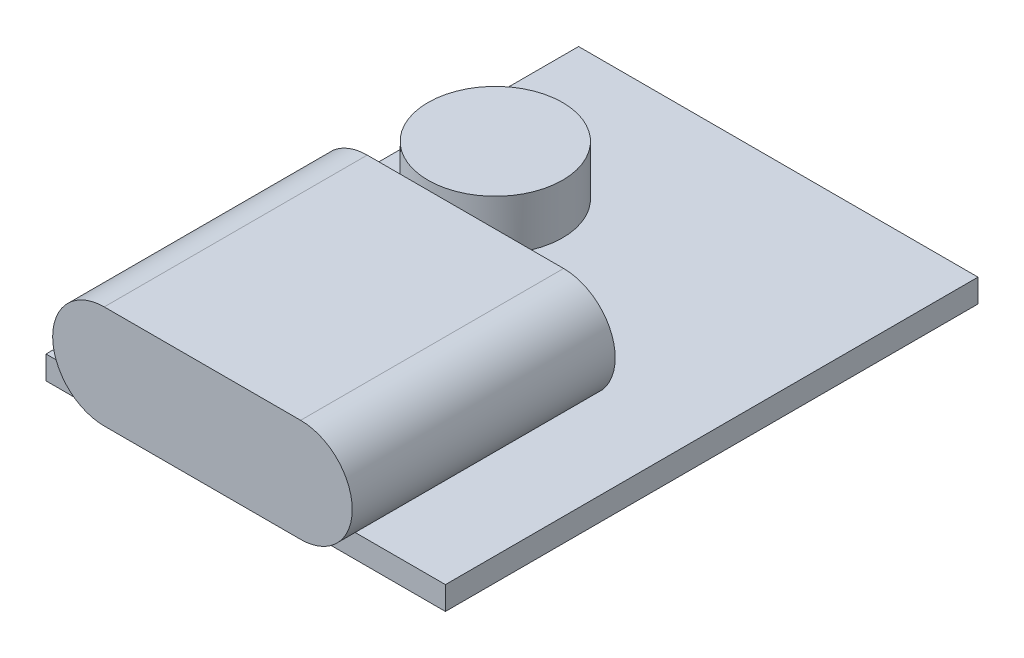
ISO-10303-21;
HEADER;
FILE_DESCRIPTION(('STEP AP214'),'2;1');
FILE_NAME('part.step','',(''),(''),'','','');
FILE_SCHEMA(('AUTOMOTIVE_DESIGN { 1 0 10303 214 1 1 1 1 }'));
ENDSEC;
DATA;
#1=APPLICATION_CONTEXT('core data for automotive mechanical design processes');
#2=APPLICATION_PROTOCOL_DEFINITION('international standard','automotive_design',2000,#1);
#3=PRODUCT_CONTEXT('',#1,'mechanical');
#4=PRODUCT('Part','Part','',(#3));
#5=PRODUCT_RELATED_PRODUCT_CATEGORY('part','',(#4));
#6=PRODUCT_DEFINITION_FORMATION('','',#4);
#7=PRODUCT_DEFINITION_CONTEXT('part definition',#1,'design');
#8=PRODUCT_DEFINITION('design','',#6,#7);
#9=PRODUCT_DEFINITION_SHAPE('','',#8);
#10=(LENGTH_UNIT() NAMED_UNIT(*) SI_UNIT(.MILLI.,.METRE.));
#11=(NAMED_UNIT(*) PLANE_ANGLE_UNIT() SI_UNIT($,.RADIAN.));
#12=(NAMED_UNIT(*) SI_UNIT($,.STERADIAN.) SOLID_ANGLE_UNIT());
#13=UNCERTAINTY_MEASURE_WITH_UNIT(LENGTH_MEASURE(1.E-05),#10,'distance_accuracy_value','');
#14=(GEOMETRIC_REPRESENTATION_CONTEXT(3) GLOBAL_UNCERTAINTY_ASSIGNED_CONTEXT((#13)) GLOBAL_UNIT_ASSIGNED_CONTEXT((#10,
#11,#12)) REPRESENTATION_CONTEXT('',''));
#15=CARTESIAN_POINT('',(0.,0.,0.));
#16=DIRECTION('',(0.,0.,1.));
#17=DIRECTION('',(1.,0.,0.));
#18=AXIS2_PLACEMENT_3D('',#15,#16,#17);
#19=CARTESIAN_POINT('',(-2.95,2.55,-6.6));
#20=DIRECTION('',(0.,0.,1.));
#21=DIRECTION('',(1.,0.,0.));
#22=AXIS2_PLACEMENT_3D('',#19,#20,#21);
#23=CYLINDRICAL_SURFACE('',#22,1.55);
#24=CARTESIAN_POINT('',(-2.95,2.55,1.3));
#25=DIRECTION('',(0.,0.,1.));
#26=DIRECTION('',(1.,0.,0.));
#27=AXIS2_PLACEMENT_3D('',#24,#25,#26);
#28=CIRCLE('',#27,1.55);
#29=CARTESIAN_POINT('',(-2.95,4.1,1.3));
#30=VERTEX_POINT('',#29);
#31=CARTESIAN_POINT('',(-2.95,1.,1.3));
#32=VERTEX_POINT('',#31);
#33=EDGE_CURVE('E109',#30,#32,#28,.T.);
#34=ORIENTED_EDGE('',*,*,#33,.F.);
#35=DIRECTION('',(0.,0.,1.));
#36=VECTOR('',#35,1.);
#37=CARTESIAN_POINT('',(-2.95,4.1,-6.6));
#38=LINE('',#37,#36);
#39=CARTESIAN_POINT('',(-2.95,4.1,-6.6));
#40=VERTEX_POINT('',#39);
#41=EDGE_CURVE('E12',#40,#30,#38,.T.);
#42=ORIENTED_EDGE('',*,*,#41,.F.);
#43=CARTESIAN_POINT('',(-2.95,2.55,-6.6));
#44=DIRECTION('',(0.,0.,1.));
#45=DIRECTION('',(1.,0.,0.));
#46=AXIS2_PLACEMENT_3D('',#43,#44,#45);
#47=CIRCLE('',#46,1.55);
#48=CARTESIAN_POINT('',(-2.95,1.,-6.6));
#49=VERTEX_POINT('',#48);
#50=EDGE_CURVE('E103',#40,#49,#47,.T.);
#51=ORIENTED_EDGE('',*,*,#50,.T.);
#52=DIRECTION('',(0.,0.,1.));
#53=VECTOR('',#52,1.);
#54=CARTESIAN_POINT('',(-2.95,1.,-6.6));
#55=LINE('',#54,#53);
#56=EDGE_CURVE('E48',#49,#32,#55,.T.);
#57=ORIENTED_EDGE('',*,*,#56,.T.);
#58=EDGE_LOOP('',(#34,#42,#51,#57));
#59=FACE_BOUND('',#58,.T.);
#60=ADVANCED_FACE('F45',(#59),#23,.T.);
#61=CARTESIAN_POINT('',(-2.95,4.1,-6.6));
#62=DIRECTION('',(0.,1.,0.));
#63=DIRECTION('',(-1.,0.,0.));
#64=AXIS2_PLACEMENT_3D('',#61,#62,#63);
#65=PLANE('',#64);
#66=DIRECTION('',(-1.,0.,0.));
#67=VECTOR('',#66,1.);
#68=CARTESIAN_POINT('',(-2.95,4.1,1.3));
#69=LINE('',#68,#67);
#70=CARTESIAN_POINT('',(2.95,4.1,1.3));
#71=VERTEX_POINT('',#70);
#72=EDGE_CURVE('E105',#71,#30,#69,.T.);
#73=ORIENTED_EDGE('',*,*,#72,.F.);
#74=DIRECTION('',(0.,0.,1.));
#75=VECTOR('',#74,1.);
#76=CARTESIAN_POINT('',(2.95,4.1,-6.6));
#77=LINE('',#76,#75);
#78=CARTESIAN_POINT('',(2.95,4.1,-6.6));
#79=VERTEX_POINT('',#78);
#80=EDGE_CURVE('E54',#79,#71,#77,.T.);
#81=ORIENTED_EDGE('',*,*,#80,.F.);
#82=DIRECTION('',(-1.,0.,0.));
#83=VECTOR('',#82,1.);
#84=CARTESIAN_POINT('',(-2.95,4.1,-6.6));
#85=LINE('',#84,#83);
#86=EDGE_CURVE('E100',#79,#40,#85,.T.);
#87=ORIENTED_EDGE('',*,*,#86,.T.);
#88=ORIENTED_EDGE('',*,*,#41,.T.);
#89=EDGE_LOOP('',(#73,#81,#87,#88));
#90=FACE_BOUND('',#89,.T.);
#91=ADVANCED_FACE('F119',(#90),#65,.T.);
#92=CARTESIAN_POINT('',(2.95,2.55,-6.6));
#93=DIRECTION('',(0.,0.,1.));
#94=DIRECTION('',(1.,0.,0.));
#95=AXIS2_PLACEMENT_3D('',#92,#93,#94);
#96=CYLINDRICAL_SURFACE('',#95,1.55);
#97=CARTESIAN_POINT('',(2.95,2.55,1.3));
#98=DIRECTION('',(0.,0.,1.));
#99=DIRECTION('',(1.,0.,0.));
#100=AXIS2_PLACEMENT_3D('',#97,#98,#99);
#101=CIRCLE('',#100,1.55);
#102=CARTESIAN_POINT('',(2.95,1.,1.3));
#103=VERTEX_POINT('',#102);
#104=EDGE_CURVE('E95',#103,#71,#101,.T.);
#105=ORIENTED_EDGE('',*,*,#104,.F.);
#106=DIRECTION('',(0.,0.,1.));
#107=VECTOR('',#106,1.);
#108=CARTESIAN_POINT('',(2.95,1.,-6.6));
#109=LINE('',#108,#107);
#110=CARTESIAN_POINT('',(2.95,1.,-6.6));
#111=VERTEX_POINT('',#110);
#112=EDGE_CURVE('E90',#111,#103,#109,.T.);
#113=ORIENTED_EDGE('',*,*,#112,.F.);
#114=CARTESIAN_POINT('',(2.95,2.55,-6.6));
#115=DIRECTION('',(0.,0.,1.));
#116=DIRECTION('',(1.,0.,0.));
#117=AXIS2_PLACEMENT_3D('',#114,#115,#116);
#118=CIRCLE('',#117,1.55);
#119=EDGE_CURVE('E93',#111,#79,#118,.T.);
#120=ORIENTED_EDGE('',*,*,#119,.T.);
#121=ORIENTED_EDGE('',*,*,#80,.T.);
#122=EDGE_LOOP('',(#105,#113,#120,#121));
#123=FACE_BOUND('',#122,.T.);
#124=ADVANCED_FACE('F92',(#123),#96,.T.);
#125=CARTESIAN_POINT('',(-2.95,1.,-6.6));
#126=DIRECTION('',(0.,-1.,0.));
#127=DIRECTION('',(1.,0.,0.));
#128=AXIS2_PLACEMENT_3D('',#125,#126,#127);
#129=PLANE('',#128);
#130=DIRECTION('',(1.,0.,0.));
#131=VECTOR('',#130,1.);
#132=CARTESIAN_POINT('',(-2.95,1.,1.3));
#133=LINE('',#132,#131);
#134=EDGE_CURVE('E112',#32,#103,#133,.T.);
#135=ORIENTED_EDGE('',*,*,#134,.F.);
#136=ORIENTED_EDGE('',*,*,#56,.F.);
#137=DIRECTION('',(1.,0.,0.));
#138=VECTOR('',#137,1.);
#139=CARTESIAN_POINT('',(-2.95,1.,-6.6));
#140=LINE('',#139,#138);
#141=EDGE_CURVE('E99',#49,#111,#140,.T.);
#142=ORIENTED_EDGE('',*,*,#141,.T.);
#143=ORIENTED_EDGE('',*,*,#112,.T.);
#144=EDGE_LOOP('',(#135,#136,#142,#143));
#145=FACE_BOUND('',#144,.T.);
#146=ADVANCED_FACE('F102',(#145),#129,.T.);
#147=CARTESIAN_POINT('',(-2.95,2.55,-6.6));
#148=DIRECTION('',(0.,0.,1.));
#149=DIRECTION('',(1.,0.,0.));
#150=AXIS2_PLACEMENT_3D('',#147,#148,#149);
#151=PLANE('',#150);
#152=ORIENTED_EDGE('',*,*,#50,.F.);
#153=ORIENTED_EDGE('',*,*,#86,.F.);
#154=ORIENTED_EDGE('',*,*,#119,.F.);
#155=ORIENTED_EDGE('',*,*,#141,.F.);
#156=EDGE_LOOP('',(#152,#153,#154,#155));
#157=FACE_BOUND('',#156,.T.);
#158=ADVANCED_FACE('F98',(#157),#151,.F.);
#159=CARTESIAN_POINT('',(-2.95,2.55,1.3));
#160=DIRECTION('',(0.,0.,1.));
#161=DIRECTION('',(1.,0.,0.));
#162=AXIS2_PLACEMENT_3D('',#159,#160,#161);
#163=PLANE('',#162);
#164=ORIENTED_EDGE('',*,*,#33,.T.);
#165=ORIENTED_EDGE('',*,*,#134,.T.);
#166=ORIENTED_EDGE('',*,*,#104,.T.);
#167=ORIENTED_EDGE('',*,*,#72,.T.);
#168=EDGE_LOOP('',(#164,#165,#166,#167));
#169=FACE_BOUND('',#168,.T.);
#170=ADVANCED_FACE('F118',(#169),#163,.T.);
#171=CLOSED_SHELL('',(#60,#91,#124,#146,#158,#170));
#172=MANIFOLD_SOLID_BREP('B2',#171);
#173=CARTESIAN_POINT('',(-6.,0.7,0.));
#174=DIRECTION('',(1.,0.,0.));
#175=DIRECTION('',(0.,0.,-1.));
#176=AXIS2_PLACEMENT_3D('',#173,#174,#175);
#177=PLANE('',#176);
#178=DIRECTION('',(0.,0.,1.));
#179=VECTOR('',#178,1.);
#180=CARTESIAN_POINT('',(-6.,0.,0.));
#181=LINE('',#180,#179);
#182=CARTESIAN_POINT('',(-6.,0.,-16.));
#183=VERTEX_POINT('',#182);
#184=CARTESIAN_POINT('',(-6.,0.,0.));
#185=VERTEX_POINT('',#184);
#186=EDGE_CURVE('E235',#183,#185,#181,.T.);
#187=ORIENTED_EDGE('',*,*,#186,.T.);
#188=DIRECTION('',(0.,-1.,0.));
#189=VECTOR('',#188,1.);
#190=CARTESIAN_POINT('',(-6.,0.7,0.));
#191=LINE('',#190,#189);
#192=CARTESIAN_POINT('',(-6.,0.7,0.));
#193=VERTEX_POINT('',#192);
#194=EDGE_CURVE('E172',#193,#185,#191,.T.);
#195=ORIENTED_EDGE('',*,*,#194,.F.);
#196=DIRECTION('',(0.,0.,1.));
#197=VECTOR('',#196,1.);
#198=CARTESIAN_POINT('',(-6.,0.7,0.));
#199=LINE('',#198,#197);
#200=CARTESIAN_POINT('',(-6.,0.7,-16.));
#201=VERTEX_POINT('',#200);
#202=EDGE_CURVE('E222',#201,#193,#199,.T.);
#203=ORIENTED_EDGE('',*,*,#202,.F.);
#204=DIRECTION('',(0.,-1.,0.));
#205=VECTOR('',#204,1.);
#206=CARTESIAN_POINT('',(-6.,0.7,-16.));
#207=LINE('',#206,#205);
#208=EDGE_CURVE('E231',#201,#183,#207,.T.);
#209=ORIENTED_EDGE('',*,*,#208,.T.);
#210=EDGE_LOOP('',(#187,#195,#203,#209));
#211=FACE_BOUND('',#210,.T.);
#212=ADVANCED_FACE('F169',(#211),#177,.F.);
#213=CARTESIAN_POINT('',(-6.,0.7,0.));
#214=DIRECTION('',(0.,0.,-1.));
#215=DIRECTION('',(-1.,0.,0.));
#216=AXIS2_PLACEMENT_3D('',#213,#214,#215);
#217=PLANE('',#216);
#218=DIRECTION('',(1.,0.,0.));
#219=VECTOR('',#218,1.);
#220=CARTESIAN_POINT('',(-6.,0.,0.));
#221=LINE('',#220,#219);
#222=CARTESIAN_POINT('',(6.,0.,0.));
#223=VERTEX_POINT('',#222);
#224=EDGE_CURVE('E227',#185,#223,#221,.T.);
#225=ORIENTED_EDGE('',*,*,#224,.T.);
#226=DIRECTION('',(0.,-1.,0.));
#227=VECTOR('',#226,1.);
#228=CARTESIAN_POINT('',(6.,0.7,0.));
#229=LINE('',#228,#227);
#230=CARTESIAN_POINT('',(6.,0.7,0.));
#231=VERTEX_POINT('',#230);
#232=EDGE_CURVE('E225',#231,#223,#229,.T.);
#233=ORIENTED_EDGE('',*,*,#232,.F.);
#234=DIRECTION('',(1.,0.,0.));
#235=VECTOR('',#234,1.);
#236=CARTESIAN_POINT('',(-6.,0.7,0.));
#237=LINE('',#236,#235);
#238=EDGE_CURVE('E217',#193,#231,#237,.T.);
#239=ORIENTED_EDGE('',*,*,#238,.F.);
#240=ORIENTED_EDGE('',*,*,#194,.T.);
#241=EDGE_LOOP('',(#225,#233,#239,#240));
#242=FACE_BOUND('',#241,.T.);
#243=ADVANCED_FACE('F226',(#242),#217,.F.);
#244=CARTESIAN_POINT('',(6.,0.7,0.));
#245=DIRECTION('',(-1.,0.,0.));
#246=DIRECTION('',(0.,0.,1.));
#247=AXIS2_PLACEMENT_3D('',#244,#245,#246);
#248=PLANE('',#247);
#249=DIRECTION('',(0.,0.,-1.));
#250=VECTOR('',#249,1.);
#251=CARTESIAN_POINT('',(6.,0.,0.));
#252=LINE('',#251,#250);
#253=CARTESIAN_POINT('',(6.,0.,-16.));
#254=VERTEX_POINT('',#253);
#255=EDGE_CURVE('E203',#223,#254,#252,.T.);
#256=ORIENTED_EDGE('',*,*,#255,.T.);
#257=DIRECTION('',(0.,-1.,0.));
#258=VECTOR('',#257,1.);
#259=CARTESIAN_POINT('',(6.,0.7,-16.));
#260=LINE('',#259,#258);
#261=CARTESIAN_POINT('',(6.,0.7,-16.));
#262=VERTEX_POINT('',#261);
#263=EDGE_CURVE('E228',#262,#254,#260,.T.);
#264=ORIENTED_EDGE('',*,*,#263,.F.);
#265=DIRECTION('',(0.,0.,-1.));
#266=VECTOR('',#265,1.);
#267=CARTESIAN_POINT('',(6.,0.7,0.));
#268=LINE('',#267,#266);
#269=EDGE_CURVE('E220',#231,#262,#268,.T.);
#270=ORIENTED_EDGE('',*,*,#269,.F.);
#271=ORIENTED_EDGE('',*,*,#232,.T.);
#272=EDGE_LOOP('',(#256,#264,#270,#271));
#273=FACE_BOUND('',#272,.T.);
#274=ADVANCED_FACE('F229',(#273),#248,.F.);
#275=CARTESIAN_POINT('',(-6.,0.7,-16.));
#276=DIRECTION('',(0.,0.,1.));
#277=DIRECTION('',(1.,0.,0.));
#278=AXIS2_PLACEMENT_3D('',#275,#276,#277);
#279=PLANE('',#278);
#280=DIRECTION('',(-1.,0.,0.));
#281=VECTOR('',#280,1.);
#282=CARTESIAN_POINT('',(-6.,0.,-16.));
#283=LINE('',#282,#281);
#284=EDGE_CURVE('E209',#254,#183,#283,.T.);
#285=ORIENTED_EDGE('',*,*,#284,.T.);
#286=ORIENTED_EDGE('',*,*,#208,.F.);
#287=DIRECTION('',(-1.,0.,0.));
#288=VECTOR('',#287,1.);
#289=CARTESIAN_POINT('',(-6.,0.7,-16.));
#290=LINE('',#289,#288);
#291=EDGE_CURVE('E186',#262,#201,#290,.T.);
#292=ORIENTED_EDGE('',*,*,#291,.F.);
#293=ORIENTED_EDGE('',*,*,#263,.T.);
#294=EDGE_LOOP('',(#285,#286,#292,#293));
#295=FACE_BOUND('',#294,.T.);
#296=ADVANCED_FACE('F243',(#295),#279,.F.);
#297=CARTESIAN_POINT('',(0.,0.7,0.));
#298=DIRECTION('',(0.,-1.,0.));
#299=DIRECTION('',(0.,0.,-1.));
#300=AXIS2_PLACEMENT_3D('',#297,#298,#299);
#301=PLANE('',#300);
#302=CARTESIAN_POINT('',(-3.2833802808625,0.7,-10.7819186892755));
#303=DIRECTION('',(0.,-1.,0.));
#304=DIRECTION('',(0.,0.,-1.));
#305=AXIS2_PLACEMENT_3D('',#302,#303,#304);
#306=CIRCLE('',#305,2.02260020441258);
#307=CARTESIAN_POINT('',(-3.2833802808625,0.7,-12.8045188936881));
#308=VERTEX_POINT('',#307);
#309=EDGE_CURVE('E43',#308,#308,#306,.F.);
#310=ORIENTED_EDGE('',*,*,#309,.F.);
#311=EDGE_LOOP('',(#310));
#312=FACE_BOUND('',#311,.T.);
#313=ORIENTED_EDGE('',*,*,#202,.T.);
#314=ORIENTED_EDGE('',*,*,#238,.T.);
#315=ORIENTED_EDGE('',*,*,#269,.T.);
#316=ORIENTED_EDGE('',*,*,#291,.T.);
#317=EDGE_LOOP('',(#313,#314,#315,#316));
#318=FACE_BOUND('',#317,.T.);
#319=ADVANCED_FACE('F218',(#312,#318),#301,.F.);
#320=CARTESIAN_POINT('',(0.,0.,0.));
#321=DIRECTION('',(0.,-1.,0.));
#322=DIRECTION('',(0.,0.,-1.));
#323=AXIS2_PLACEMENT_3D('',#320,#321,#322);
#324=PLANE('',#323);
#325=ORIENTED_EDGE('',*,*,#186,.F.);
#326=ORIENTED_EDGE('',*,*,#284,.F.);
#327=ORIENTED_EDGE('',*,*,#255,.F.);
#328=ORIENTED_EDGE('',*,*,#224,.F.);
#329=EDGE_LOOP('',(#325,#326,#327,#328));
#330=FACE_BOUND('',#329,.T.);
#331=ADVANCED_FACE('F246',(#330),#324,.T.);
#332=CARTESIAN_POINT('',(-3.2833802808625,2.2,-10.7819186892755));
#333=DIRECTION('',(0.,-1.,0.));
#334=DIRECTION('',(0.,0.,-1.));
#335=AXIS2_PLACEMENT_3D('',#332,#333,#334);
#336=CYLINDRICAL_SURFACE('',#335,2.02260020441258);
#337=CARTESIAN_POINT('',(-3.2833802808625,2.2,-10.7819186892755));
#338=DIRECTION('',(0.,1.,0.));
#339=DIRECTION('',(0.,0.,1.));
#340=AXIS2_PLACEMENT_3D('',#337,#338,#339);
#341=CIRCLE('',#340,2.02260020441258);
#342=CARTESIAN_POINT('',(-3.2833802808625,2.2,-8.75931848486289));
#343=VERTEX_POINT('',#342);
#344=EDGE_CURVE('E238',#343,#343,#341,.T.);
#345=ORIENTED_EDGE('',*,*,#344,.F.);
#346=EDGE_LOOP('',(#345));
#347=FACE_BOUND('',#346,.T.);
#348=ORIENTED_EDGE('',*,*,#309,.T.);
#349=EDGE_LOOP('',(#348));
#350=FACE_BOUND('',#349,.T.);
#351=ADVANCED_FACE('F254',(#347,#350),#336,.T.);
#352=CARTESIAN_POINT('',(-3.2833802808625,2.2,-10.7819186892755));
#353=DIRECTION('',(0.,1.,0.));
#354=DIRECTION('',(0.,0.,1.));
#355=AXIS2_PLACEMENT_3D('',#352,#353,#354);
#356=PLANE('',#355);
#357=ORIENTED_EDGE('',*,*,#344,.T.);
#358=EDGE_LOOP('',(#357));
#359=FACE_BOUND('',#358,.T.);
#360=ADVANCED_FACE('F252',(#359),#356,.T.);
#361=CLOSED_SHELL('',(#212,#243,#274,#296,#319,#331,#351,#360));
#362=MANIFOLD_SOLID_BREP('B6',#361);
#363=ADVANCED_BREP_SHAPE_REPRESENTATION('',(#18,#172,#362),#14);
#364=SHAPE_DEFINITION_REPRESENTATION(#9,#363);
ENDSEC;
END-ISO-10303-21;
